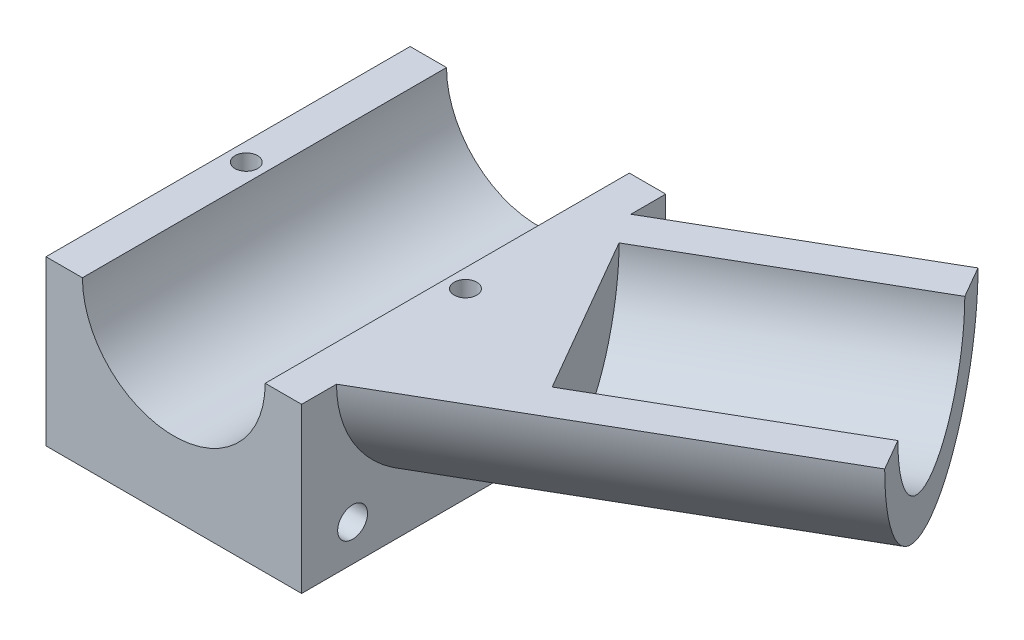
ISO-10303-21;
HEADER;
FILE_DESCRIPTION(('STEP AP214'),'2;1');
FILE_NAME('part.step','',(''),(''),'','','');
FILE_SCHEMA(('AUTOMOTIVE_DESIGN { 1 0 10303 214 1 1 1 1 }'));
ENDSEC;
DATA;
#1=APPLICATION_CONTEXT('core data for automotive mechanical design processes');
#2=APPLICATION_PROTOCOL_DEFINITION('international standard','automotive_design',2000,#1);
#3=PRODUCT_CONTEXT('',#1,'mechanical');
#4=PRODUCT('Part','Part','',(#3));
#5=PRODUCT_RELATED_PRODUCT_CATEGORY('part','',(#4));
#6=PRODUCT_DEFINITION_FORMATION('','',#4);
#7=PRODUCT_DEFINITION_CONTEXT('part definition',#1,'design');
#8=PRODUCT_DEFINITION('design','',#6,#7);
#9=PRODUCT_DEFINITION_SHAPE('','',#8);
#10=(LENGTH_UNIT() NAMED_UNIT(*) SI_UNIT(.MILLI.,.METRE.));
#11=(NAMED_UNIT(*) PLANE_ANGLE_UNIT() SI_UNIT($,.RADIAN.));
#12=(NAMED_UNIT(*) SI_UNIT($,.STERADIAN.) SOLID_ANGLE_UNIT());
#13=UNCERTAINTY_MEASURE_WITH_UNIT(LENGTH_MEASURE(1.E-05),#10,'distance_accuracy_value','');
#14=(GEOMETRIC_REPRESENTATION_CONTEXT(3) GLOBAL_UNCERTAINTY_ASSIGNED_CONTEXT((#13)) GLOBAL_UNIT_ASSIGNED_CONTEXT((#10,
#11,#12)) REPRESENTATION_CONTEXT('',''));
#15=CARTESIAN_POINT('',(0.,0.,0.));
#16=DIRECTION('',(0.,0.,1.));
#17=DIRECTION('',(1.,0.,0.));
#18=AXIS2_PLACEMENT_3D('',#15,#16,#17);
#19=CARTESIAN_POINT('',(17.55,0.,25.));
#20=DIRECTION('',(-1.,0.,0.));
#21=DIRECTION('',(0.,-1.,0.));
#22=AXIS2_PLACEMENT_3D('',#19,#20,#21);
#23=PLANE('',#22);
#24=CARTESIAN_POINT('',(17.55,5.,-18.));
#25=DIRECTION('',(-1.,0.,0.));
#26=DIRECTION('',(0.,-1.,0.));
#27=AXIS2_PLACEMENT_3D('',#24,#25,#26);
#28=CIRCLE('',#27,2.05);
#29=CARTESIAN_POINT('',(17.55,2.95,-18.));
#30=VERTEX_POINT('',#29);
#31=EDGE_CURVE('E283',#30,#30,#28,.F.);
#32=ORIENTED_EDGE('',*,*,#31,.F.);
#33=EDGE_LOOP('',(#32));
#34=FACE_BOUND('',#33,.T.);
#35=CARTESIAN_POINT('',(17.55,5.,18.));
#36=DIRECTION('',(-1.,0.,0.));
#37=DIRECTION('',(0.,-1.,0.));
#38=AXIS2_PLACEMENT_3D('',#35,#36,#37);
#39=CIRCLE('',#38,2.05);
#40=CARTESIAN_POINT('',(17.55,2.95,18.));
#41=VERTEX_POINT('',#40);
#42=EDGE_CURVE('E279',#41,#41,#39,.F.);
#43=ORIENTED_EDGE('',*,*,#42,.F.);
#44=EDGE_LOOP('',(#43));
#45=FACE_BOUND('',#44,.T.);
#46=CARTESIAN_POINT('',(17.55,22.5,0.));
#47=DIRECTION('',(-1.,0.,0.));
#48=DIRECTION('',(0.,0.,-1.));
#49=AXIS2_PLACEMENT_3D('',#46,#47,#48);
#50=ELLIPSE('',#49,20.2072594216369,17.5);
#51=CARTESIAN_POINT('',(17.55,22.5,20.2072594216369));
#52=VERTEX_POINT('',#51);
#53=CARTESIAN_POINT('',(17.55,22.5,-20.2072594216369));
#54=VERTEX_POINT('',#53);
#55=EDGE_CURVE('E59',#52,#54,#50,.F.);
#56=ORIENTED_EDGE('',*,*,#55,.F.);
#57=DIRECTION('',(0.,0.,-1.));
#58=VECTOR('',#57,1.);
#59=CARTESIAN_POINT('',(17.55,22.5,25.));
#60=LINE('',#59,#58);
#61=CARTESIAN_POINT('',(17.55,22.5,25.));
#62=VERTEX_POINT('',#61);
#63=EDGE_CURVE('E190',#62,#52,#60,.T.);
#64=ORIENTED_EDGE('',*,*,#63,.F.);
#65=DIRECTION('',(0.,1.,0.));
#66=VECTOR('',#65,1.);
#67=CARTESIAN_POINT('',(17.55,0.,25.));
#68=LINE('',#67,#66);
#69=CARTESIAN_POINT('',(17.55,0.,25.));
#70=VERTEX_POINT('',#69);
#71=EDGE_CURVE('E167',#70,#62,#68,.T.);
#72=ORIENTED_EDGE('',*,*,#71,.F.);
#73=DIRECTION('',(0.,0.,-1.));
#74=VECTOR('',#73,1.);
#75=CARTESIAN_POINT('',(17.55,0.,25.));
#76=LINE('',#75,#74);
#77=CARTESIAN_POINT('',(17.55,0.,-25.));
#78=VERTEX_POINT('',#77);
#79=EDGE_CURVE('E192',#70,#78,#76,.T.);
#80=ORIENTED_EDGE('',*,*,#79,.T.);
#81=DIRECTION('',(0.,1.,0.));
#82=VECTOR('',#81,1.);
#83=CARTESIAN_POINT('',(17.55,0.,-25.));
#84=LINE('',#83,#82);
#85=CARTESIAN_POINT('',(17.55,22.5,-25.));
#86=VERTEX_POINT('',#85);
#87=EDGE_CURVE('E180',#78,#86,#84,.T.);
#88=ORIENTED_EDGE('',*,*,#87,.T.);
#89=EDGE_CURVE('E54',#54,#86,#60,.T.);
#90=ORIENTED_EDGE('',*,*,#89,.F.);
#91=EDGE_LOOP('',(#56,#64,#72,#80,#88,#90));
#92=FACE_BOUND('',#91,.T.);
#93=ADVANCED_FACE('F33',(#34,#45,#92),#23,.F.);
#94=CARTESIAN_POINT('',(-17.55,22.5,25.));
#95=DIRECTION('',(0.,-1.,0.));
#96=DIRECTION('',(0.,0.,-1.));
#97=AXIS2_PLACEMENT_3D('',#94,#95,#96);
#98=PLANE('',#97);
#99=CARTESIAN_POINT('',(-15.05,22.5,0.));
#100=DIRECTION('',(0.,1.,0.));
#101=DIRECTION('',(0.,0.,1.));
#102=AXIS2_PLACEMENT_3D('',#99,#100,#101);
#103=CIRCLE('',#102,1.55);
#104=CARTESIAN_POINT('',(-15.05,22.5,1.55));
#105=VERTEX_POINT('',#104);
#106=EDGE_CURVE('E147',#105,#105,#103,.T.);
#107=ORIENTED_EDGE('',*,*,#106,.F.);
#108=EDGE_LOOP('',(#107));
#109=FACE_BOUND('',#108,.T.);
#110=DIRECTION('',(-1.,0.,0.));
#111=VECTOR('',#110,1.);
#112=CARTESIAN_POINT('',(-17.55,22.5,-25.));
#113=LINE('',#112,#111);
#114=CARTESIAN_POINT('',(-12.55,22.5,-25.));
#115=VERTEX_POINT('',#114);
#116=CARTESIAN_POINT('',(-17.55,22.5,-25.));
#117=VERTEX_POINT('',#116);
#118=EDGE_CURVE('E154',#115,#117,#113,.T.);
#119=ORIENTED_EDGE('',*,*,#118,.T.);
#120=DIRECTION('',(0.,0.,-1.));
#121=VECTOR('',#120,1.);
#122=CARTESIAN_POINT('',(-17.55,22.5,25.));
#123=LINE('',#122,#121);
#124=CARTESIAN_POINT('',(-17.55,22.5,25.));
#125=VERTEX_POINT('',#124);
#126=EDGE_CURVE('E11',#125,#117,#123,.T.);
#127=ORIENTED_EDGE('',*,*,#126,.F.);
#128=DIRECTION('',(-1.,0.,0.));
#129=VECTOR('',#128,1.);
#130=CARTESIAN_POINT('',(-17.55,22.5,25.));
#131=LINE('',#130,#129);
#132=CARTESIAN_POINT('',(-12.55,22.5,25.));
#133=VERTEX_POINT('',#132);
#134=EDGE_CURVE('E159',#133,#125,#131,.T.);
#135=ORIENTED_EDGE('',*,*,#134,.F.);
#136=DIRECTION('',(0.,0.,-1.));
#137=VECTOR('',#136,1.);
#138=CARTESIAN_POINT('',(-12.55,22.5,25.));
#139=LINE('',#138,#137);
#140=EDGE_CURVE('E173',#133,#115,#139,.T.);
#141=ORIENTED_EDGE('',*,*,#140,.T.);
#142=EDGE_LOOP('',(#119,#127,#135,#141));
#143=FACE_BOUND('',#142,.T.);
#144=ADVANCED_FACE('F35',(#109,#143),#98,.F.);
#145=CARTESIAN_POINT('',(-17.55,22.5,25.));
#146=DIRECTION('',(1.,0.,0.));
#147=DIRECTION('',(0.,1.,0.));
#148=AXIS2_PLACEMENT_3D('',#145,#146,#147);
#149=PLANE('',#148);
#150=CARTESIAN_POINT('',(-17.55,5.,-18.));
#151=DIRECTION('',(-1.,0.,0.));
#152=DIRECTION('',(0.,0.,1.));
#153=AXIS2_PLACEMENT_3D('',#150,#151,#152);
#154=CIRCLE('',#153,2.05);
#155=CARTESIAN_POINT('',(-17.55,5.,-15.95));
#156=VERTEX_POINT('',#155);
#157=EDGE_CURVE('E275',#156,#156,#154,.T.);
#158=ORIENTED_EDGE('',*,*,#157,.F.);
#159=EDGE_LOOP('',(#158));
#160=FACE_BOUND('',#159,.T.);
#161=CARTESIAN_POINT('',(-17.55,5.,18.));
#162=DIRECTION('',(-1.,0.,0.));
#163=DIRECTION('',(0.,0.,1.));
#164=AXIS2_PLACEMENT_3D('',#161,#162,#163);
#165=CIRCLE('',#164,2.05);
#166=CARTESIAN_POINT('',(-17.55,5.,20.05));
#167=VERTEX_POINT('',#166);
#168=EDGE_CURVE('E123',#167,#167,#165,.T.);
#169=ORIENTED_EDGE('',*,*,#168,.F.);
#170=EDGE_LOOP('',(#169));
#171=FACE_BOUND('',#170,.T.);
#172=DIRECTION('',(0.,-1.,0.));
#173=VECTOR('',#172,1.);
#174=CARTESIAN_POINT('',(-17.55,22.5,-25.));
#175=LINE('',#174,#173);
#176=CARTESIAN_POINT('',(-17.55,0.,-25.));
#177=VERTEX_POINT('',#176);
#178=EDGE_CURVE('E176',#117,#177,#175,.T.);
#179=ORIENTED_EDGE('',*,*,#178,.T.);
#180=DIRECTION('',(0.,0.,-1.));
#181=VECTOR('',#180,1.);
#182=CARTESIAN_POINT('',(-17.55,0.,25.));
#183=LINE('',#182,#181);
#184=CARTESIAN_POINT('',(-17.55,0.,25.));
#185=VERTEX_POINT('',#184);
#186=EDGE_CURVE('E47',#185,#177,#183,.T.);
#187=ORIENTED_EDGE('',*,*,#186,.F.);
#188=DIRECTION('',(0.,-1.,0.));
#189=VECTOR('',#188,1.);
#190=CARTESIAN_POINT('',(-17.55,22.5,25.));
#191=LINE('',#190,#189);
#192=EDGE_CURVE('E162',#125,#185,#191,.T.);
#193=ORIENTED_EDGE('',*,*,#192,.F.);
#194=ORIENTED_EDGE('',*,*,#126,.T.);
#195=EDGE_LOOP('',(#179,#187,#193,#194));
#196=FACE_BOUND('',#195,.T.);
#197=ADVANCED_FACE('F216',(#160,#171,#196),#149,.F.);
#198=CARTESIAN_POINT('',(-17.55,0.,25.));
#199=DIRECTION('',(0.,1.,0.));
#200=DIRECTION('',(0.,0.,1.));
#201=AXIS2_PLACEMENT_3D('',#198,#199,#200);
#202=PLANE('',#201);
#203=CARTESIAN_POINT('',(-15.05,0.,0.));
#204=DIRECTION('',(0.,1.,0.));
#205=DIRECTION('',(0.,0.,1.));
#206=AXIS2_PLACEMENT_3D('',#203,#204,#205);
#207=CIRCLE('',#206,1.55);
#208=CARTESIAN_POINT('',(-15.05,0.,1.55));
#209=VERTEX_POINT('',#208);
#210=EDGE_CURVE('E150',#209,#209,#207,.F.);
#211=ORIENTED_EDGE('',*,*,#210,.F.);
#212=EDGE_LOOP('',(#211));
#213=FACE_BOUND('',#212,.T.);
#214=CARTESIAN_POINT('',(15.05,0.,0.));
#215=DIRECTION('',(0.,1.,0.));
#216=DIRECTION('',(0.,0.,1.));
#217=AXIS2_PLACEMENT_3D('',#214,#215,#216);
#218=CIRCLE('',#217,1.55);
#219=CARTESIAN_POINT('',(15.05,0.,1.55));
#220=VERTEX_POINT('',#219);
#221=EDGE_CURVE('E151',#220,#220,#218,.F.);
#222=ORIENTED_EDGE('',*,*,#221,.F.);
#223=EDGE_LOOP('',(#222));
#224=FACE_BOUND('',#223,.T.);
#225=DIRECTION('',(1.,0.,0.));
#226=VECTOR('',#225,1.);
#227=CARTESIAN_POINT('',(-17.55,0.,-25.));
#228=LINE('',#227,#226);
#229=EDGE_CURVE('E178',#177,#78,#228,.T.);
#230=ORIENTED_EDGE('',*,*,#229,.T.);
#231=ORIENTED_EDGE('',*,*,#79,.F.);
#232=DIRECTION('',(1.,0.,0.));
#233=VECTOR('',#232,1.);
#234=CARTESIAN_POINT('',(-17.55,0.,25.));
#235=LINE('',#234,#233);
#236=EDGE_CURVE('E165',#185,#70,#235,.T.);
#237=ORIENTED_EDGE('',*,*,#236,.F.);
#238=ORIENTED_EDGE('',*,*,#186,.T.);
#239=EDGE_LOOP('',(#230,#231,#237,#238));
#240=FACE_BOUND('',#239,.T.);
#241=ADVANCED_FACE('F200',(#213,#224,#240),#202,.F.);
#242=CARTESIAN_POINT('',(17.55,22.5,25.));
#243=DIRECTION('',(0.,-1.,0.));
#244=DIRECTION('',(0.,0.,-1.));
#245=AXIS2_PLACEMENT_3D('',#242,#243,#244);
#246=PLANE('',#245);
#247=DIRECTION('',(0.499999999999978,0.,0.866025403784451));
#248=VECTOR('',#247,1.);
#249=CARTESIAN_POINT('',(32.6980762113529,22.5,5.74574587833055));
#250=LINE('',#249,#248);
#251=CARTESIAN_POINT('',(20.1480762113527,22.5,-15.9914917566604));
#252=VERTEX_POINT('',#251);
#253=CARTESIAN_POINT('',(32.6980762113529,22.5,5.74574587833055));
#254=VERTEX_POINT('',#253);
#255=EDGE_CURVE('E115',#252,#254,#250,.T.);
#256=ORIENTED_EDGE('',*,*,#255,.F.);
#257=DIRECTION('',(-0.866025403784438,0.,0.500000000000001));
#258=VECTOR('',#257,1.);
#259=CARTESIAN_POINT('',(50.2461431702997,22.5,-33.3686188174948));
#260=LINE('',#259,#258);
#261=CARTESIAN_POINT('',(50.2461431702997,22.5,-33.3686188174948));
#262=VERTEX_POINT('',#261);
#263=EDGE_CURVE('E131',#262,#252,#260,.T.);
#264=ORIENTED_EDGE('',*,*,#263,.F.);
#265=DIRECTION('',(0.500000000000001,0.,0.866025403784438));
#266=VECTOR('',#265,1.);
#267=CARTESIAN_POINT('',(50.2461431702997,22.5,-33.3686188174948));
#268=LINE('',#267,#266);
#269=CARTESIAN_POINT('',(47.7711431702997,22.5,-37.6554445662277));
#270=VERTEX_POINT('',#269);
#271=EDGE_CURVE('E223',#270,#262,#268,.T.);
#272=ORIENTED_EDGE('',*,*,#271,.F.);
#273=DIRECTION('',(-0.866025403784438,0.,0.500000000000001));
#274=VECTOR('',#273,1.);
#275=CARTESIAN_POINT('',(47.7711431702997,22.5,-37.6554445662277));
#276=LINE('',#275,#274);
#277=EDGE_CURVE('E139',#270,#54,#276,.T.);
#278=ORIENTED_EDGE('',*,*,#277,.T.);
#279=ORIENTED_EDGE('',*,*,#89,.T.);
#280=DIRECTION('',(-1.,0.,0.));
#281=VECTOR('',#280,1.);
#282=CARTESIAN_POINT('',(17.55,22.5,-25.));
#283=LINE('',#282,#281);
#284=CARTESIAN_POINT('',(12.55,22.5,-25.));
#285=VERTEX_POINT('',#284);
#286=EDGE_CURVE('E182',#86,#285,#283,.T.);
#287=ORIENTED_EDGE('',*,*,#286,.T.);
#288=DIRECTION('',(0.,0.,-1.));
#289=VECTOR('',#288,1.);
#290=CARTESIAN_POINT('',(12.55,22.5,25.));
#291=LINE('',#290,#289);
#292=CARTESIAN_POINT('',(12.55,22.5,25.));
#293=VERTEX_POINT('',#292);
#294=EDGE_CURVE('E187',#293,#285,#291,.T.);
#295=ORIENTED_EDGE('',*,*,#294,.F.);
#296=DIRECTION('',(-1.,0.,0.));
#297=VECTOR('',#296,1.);
#298=CARTESIAN_POINT('',(17.55,22.5,25.));
#299=LINE('',#298,#297);
#300=EDGE_CURVE('E169',#62,#293,#299,.T.);
#301=ORIENTED_EDGE('',*,*,#300,.F.);
#302=ORIENTED_EDGE('',*,*,#63,.T.);
#303=DIRECTION('',(-0.866025403784438,0.,0.500000000000001));
#304=VECTOR('',#303,1.);
#305=CARTESIAN_POINT('',(65.2711431702997,22.5,-7.3445554337724));
#306=LINE('',#305,#304);
#307=CARTESIAN_POINT('',(65.2711431702997,22.5,-7.3445554337724));
#308=VERTEX_POINT('',#307);
#309=EDGE_CURVE('E137',#308,#52,#306,.T.);
#310=ORIENTED_EDGE('',*,*,#309,.F.);
#311=DIRECTION('',(0.500000000000001,0.,0.866025403784438));
#312=VECTOR('',#311,1.);
#313=CARTESIAN_POINT('',(65.2711431702997,22.5,-7.3445554337724));
#314=LINE('',#313,#312);
#315=CARTESIAN_POINT('',(62.7961431702997,22.5,-11.6313811825054));
#316=VERTEX_POINT('',#315);
#317=EDGE_CURVE('E136',#316,#308,#314,.T.);
#318=ORIENTED_EDGE('',*,*,#317,.F.);
#319=DIRECTION('',(-0.866025403784438,0.,0.500000000000001));
#320=VECTOR('',#319,1.);
#321=CARTESIAN_POINT('',(62.7961431702997,22.5,-11.6313811825054));
#322=LINE('',#321,#320);
#323=EDGE_CURVE('E129',#316,#254,#322,.T.);
#324=ORIENTED_EDGE('',*,*,#323,.T.);
#325=EDGE_LOOP('',(#256,#264,#272,#278,#279,#287,#295,#301,#302,#310,#318,#324));
#326=FACE_BOUND('',#325,.T.);
#327=CARTESIAN_POINT('',(15.05,22.5,0.));
#328=DIRECTION('',(0.,1.,0.));
#329=DIRECTION('',(0.,0.,1.));
#330=AXIS2_PLACEMENT_3D('',#327,#328,#329);
#331=CIRCLE('',#330,1.55);
#332=CARTESIAN_POINT('',(15.05,22.5,1.55));
#333=VERTEX_POINT('',#332);
#334=EDGE_CURVE('E146',#333,#333,#331,.T.);
#335=ORIENTED_EDGE('',*,*,#334,.F.);
#336=EDGE_LOOP('',(#335));
#337=FACE_BOUND('',#336,.T.);
#338=ADVANCED_FACE('F133',(#326,#337),#246,.F.);
#339=CARTESIAN_POINT('',(0.,22.5,25.));
#340=DIRECTION('',(0.,0.,-1.));
#341=DIRECTION('',(-1.,0.,0.));
#342=AXIS2_PLACEMENT_3D('',#339,#340,#341);
#343=CYLINDRICAL_SURFACE('',#342,12.55);
#344=CARTESIAN_POINT('',(0.,22.5,-25.));
#345=DIRECTION('',(0.,0.,-1.));
#346=DIRECTION('',(1.,0.,0.));
#347=AXIS2_PLACEMENT_3D('',#344,#345,#346);
#348=CIRCLE('',#347,12.55);
#349=EDGE_CURVE('E163',#285,#115,#348,.T.);
#350=ORIENTED_EDGE('',*,*,#349,.T.);
#351=ORIENTED_EDGE('',*,*,#140,.F.);
#352=CARTESIAN_POINT('',(0.,22.5,25.));
#353=DIRECTION('',(0.,0.,-1.));
#354=DIRECTION('',(1.,0.,0.));
#355=AXIS2_PLACEMENT_3D('',#352,#353,#354);
#356=CIRCLE('',#355,12.55);
#357=EDGE_CURVE('E171',#293,#133,#356,.T.);
#358=ORIENTED_EDGE('',*,*,#357,.F.);
#359=ORIENTED_EDGE('',*,*,#294,.T.);
#360=EDGE_LOOP('',(#350,#351,#358,#359));
#361=FACE_BOUND('',#360,.T.);
#362=ADVANCED_FACE('F220',(#361),#343,.F.);
#363=CARTESIAN_POINT('',(0.,22.5,25.));
#364=DIRECTION('',(0.,0.,1.));
#365=DIRECTION('',(1.,0.,0.));
#366=AXIS2_PLACEMENT_3D('',#363,#364,#365);
#367=PLANE('',#366);
#368=ORIENTED_EDGE('',*,*,#134,.T.);
#369=ORIENTED_EDGE('',*,*,#192,.T.);
#370=ORIENTED_EDGE('',*,*,#236,.T.);
#371=ORIENTED_EDGE('',*,*,#71,.T.);
#372=ORIENTED_EDGE('',*,*,#300,.T.);
#373=ORIENTED_EDGE('',*,*,#357,.T.);
#374=EDGE_LOOP('',(#368,#369,#370,#371,#372,#373));
#375=FACE_BOUND('',#374,.T.);
#376=ADVANCED_FACE('F212',(#375),#367,.T.);
#377=CARTESIAN_POINT('',(0.,22.5,-25.));
#378=DIRECTION('',(0.,0.,1.));
#379=DIRECTION('',(1.,0.,0.));
#380=AXIS2_PLACEMENT_3D('',#377,#378,#379);
#381=PLANE('',#380);
#382=ORIENTED_EDGE('',*,*,#118,.F.);
#383=ORIENTED_EDGE('',*,*,#349,.F.);
#384=ORIENTED_EDGE('',*,*,#286,.F.);
#385=ORIENTED_EDGE('',*,*,#87,.F.);
#386=ORIENTED_EDGE('',*,*,#229,.F.);
#387=ORIENTED_EDGE('',*,*,#178,.F.);
#388=EDGE_LOOP('',(#382,#383,#384,#385,#386,#387));
#389=FACE_BOUND('',#388,.T.);
#390=ADVANCED_FACE('F206',(#389),#381,.F.);
#391=CARTESIAN_POINT('',(15.05,-4.3840620433566,0.));
#392=DIRECTION('',(0.,1.,0.));
#393=DIRECTION('',(0.,0.,1.));
#394=AXIS2_PLACEMENT_3D('',#391,#392,#393);
#395=CYLINDRICAL_SURFACE('',#394,1.55);
#396=ORIENTED_EDGE('',*,*,#221,.T.);
#397=EDGE_LOOP('',(#396));
#398=FACE_BOUND('',#397,.T.);
#399=ORIENTED_EDGE('',*,*,#334,.T.);
#400=EDGE_LOOP('',(#399));
#401=FACE_BOUND('',#400,.T.);
#402=ADVANCED_FACE('F363',(#398,#401),#395,.F.);
#403=CARTESIAN_POINT('',(-15.05,-4.3840620433566,0.));
#404=DIRECTION('',(0.,1.,0.));
#405=DIRECTION('',(0.,0.,1.));
#406=AXIS2_PLACEMENT_3D('',#403,#404,#405);
#407=CYLINDRICAL_SURFACE('',#406,1.55);
#408=ORIENTED_EDGE('',*,*,#210,.T.);
#409=EDGE_LOOP('',(#408));
#410=FACE_BOUND('',#409,.T.);
#411=ORIENTED_EDGE('',*,*,#106,.T.);
#412=EDGE_LOOP('',(#411));
#413=FACE_BOUND('',#412,.T.);
#414=ADVANCED_FACE('F369',(#410,#413),#407,.F.);
#415=CARTESIAN_POINT('',(56.5211431702997,22.5,-22.5000000000001));
#416=DIRECTION('',(-0.866025403784438,0.,0.500000000000001));
#417=DIRECTION('',(0.500000000000001,0.,0.866025403784438));
#418=AXIS2_PLACEMENT_3D('',#415,#416,#417);
#419=CYLINDRICAL_SURFACE('',#418,17.5);
#420=CARTESIAN_POINT('',(41.9807621135332,5.01716913654997,-15.));
#421=CARTESIAN_POINT('',(41.9807658247177,5.02051488541106,-15.087143185435));
#422=CARTESIAN_POINT('',(41.9881350232241,5.02419160375837,-15.1743330752277));
#423=CARTESIAN_POINT('',(42.0174201624989,5.03179449191005,-15.3462946678871));
#424=CARTESIAN_POINT('',(42.0393529122383,5.03572094521316,-15.4310634583127));
#425=CARTESIAN_POINT('',(42.0971451092497,5.04337596095783,-15.5956895310062));
#426=CARTESIAN_POINT('',(42.1329984635463,5.0471046091672,-15.6755489443932));
#427=CARTESIAN_POINT('',(42.2176185620728,5.05394335332736,-15.8281073145767));
#428=CARTESIAN_POINT('',(42.2663820820215,5.05705360338239,-15.9008080530231));
#429=CARTESIAN_POINT('',(42.3754125606899,5.06230161123558,-16.0369506378212));
#430=CARTESIAN_POINT('',(42.4356706325874,5.06444011603065,-16.1003995706229));
#431=CARTESIAN_POINT('',(42.5660084921378,5.06750439287015,-16.2162873211166));
#432=CARTESIAN_POINT('',(42.6360884181523,5.06843014782853,-16.2687259836797));
#433=CARTESIAN_POINT('',(42.7838040422026,5.06896207043048,-16.3609213759839));
#434=CARTESIAN_POINT('',(42.861412184756,5.06857288636931,-16.4007222353402));
#435=CARTESIAN_POINT('',(43.0221814150967,5.06652949396921,-16.4667643709881));
#436=CARTESIAN_POINT('',(43.1053424707372,5.06487529295315,-16.4930057257707));
#437=CARTESIAN_POINT('',(43.2748006323134,5.06049085661786,-16.531183383163));
#438=CARTESIAN_POINT('',(43.3610956965286,5.05776131083286,-16.5431288328347));
#439=CARTESIAN_POINT('',(43.5344407872384,5.05153374546895,-16.5524241176234));
#440=CARTESIAN_POINT('',(43.6214908288464,5.04803571047201,-16.5497736598801));
#441=CARTESIAN_POINT('',(43.7941863129885,5.04065131046051,-16.5299301880739));
#442=CARTESIAN_POINT('',(43.8798263074595,5.03676372707245,-16.5126902068776));
#443=CARTESIAN_POINT('',(44.0470064758129,5.02904644112239,-16.4640934773297));
#444=CARTESIAN_POINT('',(44.1285465880031,5.02521673943196,-16.432736516626));
#445=CARTESIAN_POINT('',(44.2853941811263,5.0180373932872,-16.3567024104584));
#446=CARTESIAN_POINT('',(44.3606884266376,5.01468875779008,-16.3119978577248));
#447=CARTESIAN_POINT('',(44.5027124388716,5.00885858979015,-16.2105485897853));
#448=CARTESIAN_POINT('',(44.5694423472888,5.00637704294044,-16.1538040738182));
#449=CARTESIAN_POINT('',(44.6922846462227,5.00256578351808,-16.0300246344604));
#450=CARTESIAN_POINT('',(44.7484211095939,5.0012334342385,-15.9630136848798));
#451=CARTESIAN_POINT('',(44.848656727993,4.99986115068793,-15.8205131268587));
#452=CARTESIAN_POINT('',(44.8927561315844,4.99982118972732,-15.7450236935431));
#453=CARTESIAN_POINT('',(44.9675425827208,5.00103621027518,-15.5879659685442));
#454=CARTESIAN_POINT('',(44.9982703431955,5.00228722135379,-15.5064170268548));
#455=CARTESIAN_POINT('',(45.0456478550477,5.00593781539643,-15.339352563927));
#456=CARTESIAN_POINT('',(45.0622975154923,5.00833740577918,-15.2538370170715));
#457=CARTESIAN_POINT('',(45.0810713790936,5.0140194897661,-15.0811755978111));
#458=CARTESIAN_POINT('',(45.0831820489384,5.01730280301261,-14.9940282821312));
#459=CARTESIAN_POINT('',(45.0727965899612,5.02438446957236,-14.8206290808291));
#460=CARTESIAN_POINT('',(45.0603001150832,5.02818283508577,-14.7343772164697));
#461=CARTESIAN_POINT('',(45.0209872910769,5.03588398856854,-14.5648871467972));
#462=CARTESIAN_POINT('',(44.9941211578437,5.03978709448855,-14.4816604995374));
#463=CARTESIAN_POINT('',(44.926791378623,5.04724555193886,-14.3208844925123));
#464=CARTESIAN_POINT('',(44.8863276761296,5.05080090202396,-14.2433351563411));
#465=CARTESIAN_POINT('',(44.7929054694998,5.05716403914489,-14.0960625371467));
#466=CARTESIAN_POINT('',(44.7399390623546,5.05997135094359,-14.0263442454645));
#467=CARTESIAN_POINT('',(44.6230204262827,5.06451594456939,-13.8967841319223));
#468=CARTESIAN_POINT('',(44.5590684427092,5.06625325029019,-13.8369420895434));
#469=CARTESIAN_POINT('',(44.4222216404985,5.0684557590039,-13.7290285070601));
#470=CARTESIAN_POINT('',(44.3493563861302,5.06892505434119,-13.6809195583151));
#471=CARTESIAN_POINT('',(44.1965964378821,5.06854988835928,-13.5975970703277));
#472=CARTESIAN_POINT('',(44.1167018460429,5.06770544610786,-13.5623833439314));
#473=CARTESIAN_POINT('',(43.9523317157076,5.0648020105989,-13.5059064092721));
#474=CARTESIAN_POINT('',(43.8678659178536,5.06274551417978,-13.4846147112132));
#475=CARTESIAN_POINT('',(43.6965922278075,5.05765237919699,-13.4564545158633));
#476=CARTESIAN_POINT('',(43.609784294249,5.05461572331155,-13.4495862734856));
#477=CARTESIAN_POINT('',(43.4360640850612,5.04789572971563,-13.4504533543363));
#478=CARTESIAN_POINT('',(43.3491520389539,5.0442108988445,-13.4582228077459));
#479=CARTESIAN_POINT('',(43.1778653340746,5.03661332819728,-13.4882051163077));
#480=CARTESIAN_POINT('',(43.0934907324136,5.03270058329728,-13.5104182962947));
#481=CARTESIAN_POINT('',(42.9293900057362,5.0250735583021,-13.5687565165489));
#482=CARTESIAN_POINT('',(42.8496790817623,5.02135993018474,-13.6049244166421));
#483=CARTESIAN_POINT('',(42.6974499915576,5.01456257256871,-13.6901527899411));
#484=CARTESIAN_POINT('',(42.6249315180304,5.01147881615292,-13.7392127120102));
#485=CARTESIAN_POINT('',(42.4892227935037,5.00629145108672,-13.8487859571026));
#486=CARTESIAN_POINT('',(42.4260227221425,5.0041868054666,-13.9092870668521));
#487=CARTESIAN_POINT('',(42.3106573208382,5.00119012852919,-14.0400790020324));
#488=CARTESIAN_POINT('',(42.2584942656721,5.00029834698328,-14.11037184064));
#489=CARTESIAN_POINT('',(42.1668598784953,4.99982928398992,-14.2584913338711));
#490=CARTESIAN_POINT('',(42.1273504369816,5.00024801377962,-14.3362944304561));
#491=CARTESIAN_POINT('',(42.0619614535911,5.00234469993039,-14.4973452818179));
#492=CARTESIAN_POINT('',(42.0360666864074,5.00402124455953,-14.5805868370891));
#493=CARTESIAN_POINT('',(42.0051754127527,5.00766027002212,-14.7202559830079));
#494=CARTESIAN_POINT('',(41.9960313269252,5.00931444935651,-14.7758098321345));
#495=CARTESIAN_POINT('',(41.9838234830696,5.01298953875833,-14.887569307125));
#496=CARTESIAN_POINT('',(41.9807597190648,5.01501044846528,-14.9437749323482));
#497=CARTESIAN_POINT('',(41.9807621135332,5.01716913654997,-15.));
#498=B_SPLINE_CURVE_WITH_KNOTS('',3,(#420,#421,#422,#423,#424,#425,#426,#427,#428,#429,#430,
#431,#432,#433,#434,#435,#436,#437,#438,#439,#440,#441,#442,#443,#444,#445,#446,#447,#448,#449,
#450,#451,#452,#453,#454,#455,#456,#457,#458,#459,#460,#461,#462,#463,#464,#465,#466,#467,#468,
#469,#470,#471,#472,#473,#474,#475,#476,#477,#478,#479,#480,#481,#482,#483,#484,#485,#486,#487,
#488,#489,#490,#491,#492,#493,#494,#495,#496,#497),.UNSPECIFIED.,.T.,.F.,(4,2,2,2,2,2,2,2,2,2,2,
2,2,2,2,2,2,2,2,2,2,2,2,2,2,2,2,2,2,2,2,2,2,2,2,2,2,2,4),(0.,0.261417041692894,
0.523136331587713,0.784741197230178,1.04628078925154,1.30761898985787,1.56896087233503,
1.82937988204094,2.08979738425949,2.35004817224881,2.61030418207106,2.87140121887038,
3.13250218330369,3.39414301010305,3.65577950757346,3.91681409989391,4.17784330147831,
4.4380720843241,4.69830254802123,4.9587752090487,5.21925404102779,5.48064121119822,
5.74202946759992,6.00358339309212,6.26513147776482,6.52583443485612,6.78653360810313,
7.04669760746464,7.30686620480255,7.56764217863701,7.82842401744367,8.09001326758611,
8.35159133655116,8.61289173566715,8.87424593758183,9.13480543824102,9.39507293177166,
9.56374022605204,9.73240735453912),.UNSPECIFIED.);
#499=CARTESIAN_POINT('',(41.9807621135332,5.01716913654997,-15.));
#500=VERTEX_POINT('',#499);
#501=EDGE_CURVE('E232',#500,#500,#498,.T.);
#502=ORIENTED_EDGE('',*,*,#501,.F.);
#503=EDGE_LOOP('',(#502));
#504=FACE_BOUND('',#503,.T.);
#505=ORIENTED_EDGE('',*,*,#309,.T.);
#506=ORIENTED_EDGE('',*,*,#55,.T.);
#507=ORIENTED_EDGE('',*,*,#277,.F.);
#508=CARTESIAN_POINT('',(56.5211431702997,22.5,-22.5000000000001));
#509=DIRECTION('',(0.866025403784438,0.,-0.500000000000001));
#510=DIRECTION('',(-0.500000000000001,0.,-0.866025403784438));
#511=AXIS2_PLACEMENT_3D('',#508,#509,#510);
#512=CIRCLE('',#511,17.5);
#513=EDGE_CURVE('E228',#308,#270,#512,.T.);
#514=ORIENTED_EDGE('',*,*,#513,.F.);
#515=EDGE_LOOP('',(#505,#506,#507,#514));
#516=FACE_BOUND('',#515,.T.);
#517=ADVANCED_FACE('F227',(#504,#516),#419,.T.);
#518=CARTESIAN_POINT('',(56.5211431702997,22.5,-22.5000000000001));
#519=DIRECTION('',(-0.866025403784438,0.,0.500000000000001));
#520=DIRECTION('',(0.500000000000001,0.,0.866025403784438));
#521=AXIS2_PLACEMENT_3D('',#518,#519,#520);
#522=CYLINDRICAL_SURFACE('',#521,12.55);
#523=CARTESIAN_POINT('',(41.9807621135332,9.97395213964117,-15.));
#524=CARTESIAN_POINT('',(41.9807656717825,9.97862588513993,-15.0872186130021));
#525=CARTESIAN_POINT('',(41.9881471132703,9.98376281884103,-15.1744683160175));
#526=CARTESIAN_POINT('',(42.0174714991723,9.99438757749894,-15.3465315890559));
#527=CARTESIAN_POINT('',(42.0394306054606,9.99987578579556,-15.4313423460787));
#528=CARTESIAN_POINT('',(42.0972935519126,10.0105787733354,-15.5960546347224));
#529=CARTESIAN_POINT('',(42.1331918148238,10.0157936609921,-15.6759581150232));
#530=CARTESIAN_POINT('',(42.2179314219815,10.0253602322127,-15.8286104185215));
#531=CARTESIAN_POINT('',(42.2667695208352,10.0297121317415,-15.9013610294398));
#532=CARTESIAN_POINT('',(42.3759434099552,10.0370510309503,-16.0375437991873));
#533=CARTESIAN_POINT('',(42.4362607622062,10.0400401936702,-16.1009906163374));
#534=CARTESIAN_POINT('',(42.5667374792028,10.0443194521051,-16.216868474804));
#535=CARTESIAN_POINT('',(42.6368967417562,10.0456095654606,-16.2692996304863));
#536=CARTESIAN_POINT('',(42.7845283561421,10.0463387553896,-16.3613039506516));
#537=CARTESIAN_POINT('',(42.861947138665,10.045790491481,-16.4009630000015));
#538=CARTESIAN_POINT('',(43.0222906424168,10.0429337998893,-16.4667881440315));
#539=CARTESIAN_POINT('',(43.1052153148697,10.0406253877972,-16.4929543582248));
#540=CARTESIAN_POINT('',(43.2741077341196,10.0345153990275,-16.5310498684516));
#541=CARTESIAN_POINT('',(43.3600715690091,10.0307156824936,-16.5429968259691));
#542=CARTESIAN_POINT('',(43.532735134209,10.0220509679691,-16.5524085428325));
#543=CARTESIAN_POINT('',(43.6194348939115,10.0171859272364,-16.5498727210096));
#544=CARTESIAN_POINT('',(43.7917143431735,10.0069004612318,-16.5303484800891));
#545=CARTESIAN_POINT('',(43.877283517967,10.0014767262888,-16.5132689981333));
#546=CARTESIAN_POINT('',(44.0443592397794,9.99070685372135,-16.465018448236));
#547=CARTESIAN_POINT('',(44.1258656704897,9.98536071832157,-16.4338469771243));
#548=CARTESIAN_POINT('',(44.2828576508458,9.97532260928598,-16.3581155440008));
#549=CARTESIAN_POINT('',(44.3583175340746,9.97063336694709,-16.3135019781612));
#550=CARTESIAN_POINT('',(44.5006948926214,9.96246363037328,-16.2121734111621));
#551=CARTESIAN_POINT('',(44.5676126406003,9.95898309755082,-16.1554587964169));
#552=CARTESIAN_POINT('',(44.6906981195408,9.95363663911571,-16.0318064093117));
#553=CARTESIAN_POINT('',(44.7469123345201,9.95176360185631,-15.9649152230708));
#554=CARTESIAN_POINT('',(44.8473313605441,9.94981725935061,-15.8226339640776));
#555=CARTESIAN_POINT('',(44.8915366533523,9.94974388189657,-15.7472442324344));
#556=CARTESIAN_POINT('',(44.9664429286812,9.95139989230297,-15.5906039314837));
#557=CARTESIAN_POINT('',(44.9972227030659,9.95311855544732,-15.5093909063715));
#558=CARTESIAN_POINT('',(45.0448049768512,9.95815033819041,-15.3430169581828));
#559=CARTESIAN_POINT('',(45.0616073100367,9.96146347674939,-15.2578559881712));
#560=CARTESIAN_POINT('',(45.08080605636,9.96932342575855,-15.0858330211456));
#561=CARTESIAN_POINT('',(45.083177265343,9.97387238011627,-14.9989683137339));
#562=CARTESIAN_POINT('',(45.0734073419006,9.98369740247235,-14.8260995762209));
#563=CARTESIAN_POINT('',(45.061265549043,9.98897350355076,-14.7400955854672));
#564=CARTESIAN_POINT('',(45.0226862555967,9.99970552155195,-14.5707514010194));
#565=CARTESIAN_POINT('',(44.9961526603958,10.0051624130051,-14.4874331476068));
#566=CARTESIAN_POINT('',(44.9294634443061,10.0156085016796,-14.3264059373132));
#567=CARTESIAN_POINT('',(44.8893076939882,10.0205976944566,-14.2486970337372));
#568=CARTESIAN_POINT('',(44.7964193924605,10.0295494524947,-14.1009819777043));
#569=CARTESIAN_POINT('',(44.7436699300893,10.0335106222433,-14.0309863691802));
#570=CARTESIAN_POINT('',(44.6271036086904,10.0399427163559,-13.9008338474298));
#571=CARTESIAN_POINT('',(44.5632872422272,10.0424137070228,-13.8406764965549));
#572=CARTESIAN_POINT('',(44.4268379125929,10.0455696245515,-13.7322885308562));
#573=CARTESIAN_POINT('',(44.3542625688986,10.0462656219735,-13.6839856971885));
#574=CARTESIAN_POINT('',(44.2020569390013,10.0458236689966,-13.6002110941057));
#575=CARTESIAN_POINT('',(44.1224268467809,10.0446857690092,-13.564738972024));
#576=CARTESIAN_POINT('',(43.9587314819579,10.0407151834537,-13.5077456274331));
#577=CARTESIAN_POINT('',(43.8746857153693,10.0378894600051,-13.4861678476474));
#578=CARTESIAN_POINT('',(43.7042301946819,10.0308691040636,-13.4573135696484));
#579=CARTESIAN_POINT('',(43.6178203655483,10.0266744280742,-13.450037525904));
#580=CARTESIAN_POINT('',(43.4446573148397,10.0173655504346,-13.4499625964461));
#581=CARTESIAN_POINT('',(43.3579042873561,10.0122473171664,-13.4572286539516));
#582=CARTESIAN_POINT('',(43.1868495567581,10.0016770443595,-13.486147657834));
#583=CARTESIAN_POINT('',(43.1025479572008,9.99622499074922,-13.5078012110709));
#584=CARTESIAN_POINT('',(42.9382314277884,9.98556134690064,-13.5650704624569));
#585=CARTESIAN_POINT('',(42.8582456770589,9.98035142021361,-13.600770249599));
#586=CARTESIAN_POINT('',(42.7053788391215,9.97079382969938,-13.6851375529656));
#587=CARTESIAN_POINT('',(42.6324974313799,9.96644612696119,-13.7338044837681));
#588=CARTESIAN_POINT('',(42.4960447590928,9.95910959983395,-13.8426484315445));
#589=CARTESIAN_POINT('',(42.4324567005815,9.95611830318682,-13.9028042214644));
#590=CARTESIAN_POINT('',(42.3162595658421,9.95182061113483,-14.0329963364175));
#591=CARTESIAN_POINT('',(42.26365231118,9.95051449509264,-14.1030342975441));
#592=CARTESIAN_POINT('',(42.1712561282895,9.94973799371781,-14.2504877136763));
#593=CARTESIAN_POINT('',(42.1313879932299,9.95025601438464,-14.3278535439482));
#594=CARTESIAN_POINT('',(42.0651793925436,9.95304468867727,-14.4880762213062));
#595=CARTESIAN_POINT('',(42.0388248323157,9.9553135100111,-14.5709272450696));
#596=CARTESIAN_POINT('',(42.0066790054876,9.96034476129735,-14.7118347412528));
#597=CARTESIAN_POINT('',(41.9969711667119,9.96269678704527,-14.7690443512301));
#598=CARTESIAN_POINT('',(41.9840115392583,9.96794848917555,-14.8841647365431));
#599=CARTESIAN_POINT('',(41.9807597503935,9.97084816554206,-14.9420755118586));
#600=CARTESIAN_POINT('',(41.9807621135332,9.97395213964117,-15.));
#601=B_SPLINE_CURVE_WITH_KNOTS('',3,(#523,#524,#525,#526,#527,#528,#529,#530,#531,#532,#533,
#534,#535,#536,#537,#538,#539,#540,#541,#542,#543,#544,#545,#546,#547,#548,#549,#550,#551,#552,
#553,#554,#555,#556,#557,#558,#559,#560,#561,#562,#563,#564,#565,#566,#567,#568,#569,#570,#571,
#572,#573,#574,#575,#576,#577,#578,#579,#580,#581,#582,#583,#584,#585,#586,#587,#588,#589,#590,
#591,#592,#593,#594,#595,#596,#597,#598,#599,#600),.UNSPECIFIED.,.T.,.F.,(4,2,2,2,2,2,2,2,2,2,2,
2,2,2,2,2,2,2,2,2,2,2,2,2,2,2,2,2,2,2,2,2,2,2,2,2,2,2,4),(0.,0.26181995864289,0.52393067605305,
0.785936627166155,1.04787692763069,1.30939999633542,1.5709203497479,1.83064351847477,
2.09036438665188,2.34976232240678,2.60917066742304,2.8702153023031,3.13126740611214,
3.39337461932612,3.65547346410785,3.91640670255884,4.17732947157026,4.43669962554223,
4.69607286381479,4.95589897127884,5.2157369029016,5.47733153161306,5.73892864590185,
6.00087903512881,6.26281776848899,6.52311876031197,6.78341259692631,7.04264008867139,
7.30187581780295,7.56227184483131,7.82267885597908,8.08466913426138,8.34664758658676,
8.60814660454693,8.86968896722425,9.12957200576332,9.38918343320791,9.56306589942211,
9.73694836060323),.UNSPECIFIED.);
#602=CARTESIAN_POINT('',(41.9807621135332,9.97395213964117,-15.));
#603=VERTEX_POINT('',#602);
#604=EDGE_CURVE('E37',#603,#603,#601,.T.);
#605=ORIENTED_EDGE('',*,*,#604,.T.);
#606=EDGE_LOOP('',(#605));
#607=FACE_BOUND('',#606,.T.);
#608=ORIENTED_EDGE('',*,*,#263,.T.);
#609=CARTESIAN_POINT('',(26.4230762113528,22.5,-5.12287293916491));
#610=DIRECTION('',(0.866025403784451,0.,-0.499999999999978));
#611=DIRECTION('',(-0.499999999999978,0.,-0.866025403784451));
#612=AXIS2_PLACEMENT_3D('',#609,#610,#611);
#613=CIRCLE('',#612,12.5500000000007);
#614=EDGE_CURVE('E118',#254,#252,#613,.T.);
#615=ORIENTED_EDGE('',*,*,#614,.F.);
#616=ORIENTED_EDGE('',*,*,#323,.F.);
#617=CARTESIAN_POINT('',(56.5211431702997,22.5,-22.5000000000001));
#618=DIRECTION('',(-0.866025403784438,0.,0.500000000000001));
#619=DIRECTION('',(-0.500000000000001,0.,-0.866025403784438));
#620=AXIS2_PLACEMENT_3D('',#617,#618,#619);
#621=CIRCLE('',#620,12.55);
#622=EDGE_CURVE('E241',#262,#316,#621,.T.);
#623=ORIENTED_EDGE('',*,*,#622,.F.);
#624=EDGE_LOOP('',(#608,#615,#616,#623));
#625=FACE_BOUND('',#624,.T.);
#626=ADVANCED_FACE('F127',(#607,#625),#522,.F.);
#627=CARTESIAN_POINT('',(56.5211431702997,22.5,-22.5000000000001));
#628=DIRECTION('',(0.866025403784438,0.,-0.500000000000001));
#629=DIRECTION('',(-0.500000000000001,0.,-0.866025403784438));
#630=AXIS2_PLACEMENT_3D('',#627,#628,#629);
#631=PLANE('',#630);
#632=ORIENTED_EDGE('',*,*,#513,.T.);
#633=ORIENTED_EDGE('',*,*,#271,.T.);
#634=ORIENTED_EDGE('',*,*,#622,.T.);
#635=ORIENTED_EDGE('',*,*,#317,.T.);
#636=EDGE_LOOP('',(#632,#633,#634,#635));
#637=FACE_BOUND('',#636,.T.);
#638=ADVANCED_FACE('F243',(#637),#631,.T.);
#639=CARTESIAN_POINT('',(43.5307621135332,-0.00100000000003916,-15.));
#640=DIRECTION('',(0.,1.,0.));
#641=DIRECTION('',(-1.,0.,0.));
#642=AXIS2_PLACEMENT_3D('',#639,#640,#641);
#643=CYLINDRICAL_SURFACE('',#642,1.55);
#644=ORIENTED_EDGE('',*,*,#501,.T.);
#645=EDGE_LOOP('',(#644));
#646=FACE_BOUND('',#645,.T.);
#647=ORIENTED_EDGE('',*,*,#604,.F.);
#648=EDGE_LOOP('',(#647));
#649=FACE_BOUND('',#648,.T.);
#650=ADVANCED_FACE('F245',(#646,#649),#643,.F.);
#651=CARTESIAN_POINT('',(23.3482756057297,5.,18.));
#652=DIRECTION('',(-1.,0.,0.));
#653=DIRECTION('',(0.,0.,1.));
#654=AXIS2_PLACEMENT_3D('',#651,#652,#653);
#655=CYLINDRICAL_SURFACE('',#654,2.05);
#656=ORIENTED_EDGE('',*,*,#42,.T.);
#657=EDGE_LOOP('',(#656));
#658=FACE_BOUND('',#657,.T.);
#659=ORIENTED_EDGE('',*,*,#168,.T.);
#660=EDGE_LOOP('',(#659));
#661=FACE_BOUND('',#660,.T.);
#662=ADVANCED_FACE('F251',(#658,#661),#655,.F.);
#663=CARTESIAN_POINT('',(23.3482756057297,5.,-18.));
#664=DIRECTION('',(-1.,0.,0.));
#665=DIRECTION('',(0.,0.,1.));
#666=AXIS2_PLACEMENT_3D('',#663,#664,#665);
#667=CYLINDRICAL_SURFACE('',#666,2.05);
#668=ORIENTED_EDGE('',*,*,#31,.T.);
#669=EDGE_LOOP('',(#668));
#670=FACE_BOUND('',#669,.T.);
#671=ORIENTED_EDGE('',*,*,#157,.T.);
#672=EDGE_LOOP('',(#671));
#673=FACE_BOUND('',#672,.T.);
#674=ADVANCED_FACE('F287',(#670,#673),#667,.F.);
#675=CARTESIAN_POINT('',(26.4230762113528,22.5,-5.12287293916491));
#676=DIRECTION('',(0.866025403784451,0.,-0.499999999999978));
#677=DIRECTION('',(-0.499999999999978,0.,-0.866025403784451));
#678=AXIS2_PLACEMENT_3D('',#675,#676,#677);
#679=PLANE('',#678);
#680=ORIENTED_EDGE('',*,*,#614,.T.);
#681=ORIENTED_EDGE('',*,*,#255,.T.);
#682=EDGE_LOOP('',(#680,#681));
#683=FACE_BOUND('',#682,.T.);
#684=ADVANCED_FACE('F117',(#683),#679,.T.);
#685=CLOSED_SHELL('',(#93,#144,#197,#241,#338,#362,#376,#390,#402,#414,#517,#626,#638,#650,#662,
#674,#684));
#686=MANIFOLD_SOLID_BREP('B2',#685);
#687=ADVANCED_BREP_SHAPE_REPRESENTATION('',(#18,#686),#14);
#688=SHAPE_DEFINITION_REPRESENTATION(#9,#687);
ENDSEC;
END-ISO-10303-21;
